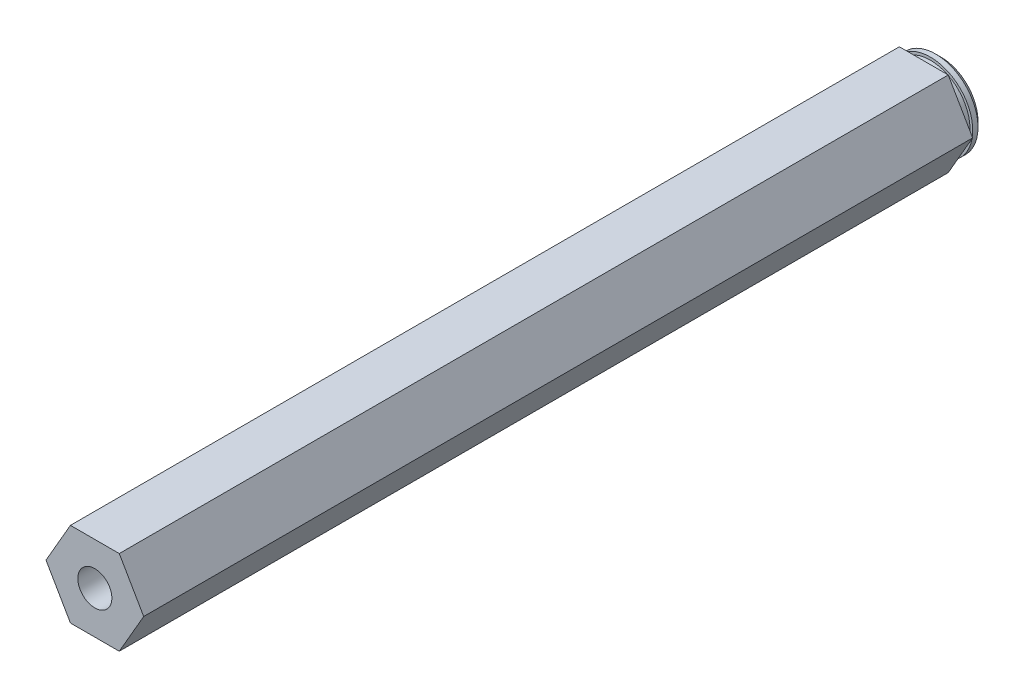
ISO-10303-21;
HEADER;
FILE_DESCRIPTION(('STEP AP214'),'2;1');
FILE_NAME('part.step','',(''),(''),'','','');
FILE_SCHEMA(('AUTOMOTIVE_DESIGN { 1 0 10303 214 1 1 1 1 }'));
ENDSEC;
DATA;
#1=APPLICATION_CONTEXT('core data for automotive mechanical design processes');
#2=APPLICATION_PROTOCOL_DEFINITION('international standard','automotive_design',2000,#1);
#3=PRODUCT_CONTEXT('',#1,'mechanical');
#4=PRODUCT('Part','Part','',(#3));
#5=PRODUCT_RELATED_PRODUCT_CATEGORY('part','',(#4));
#6=PRODUCT_DEFINITION_FORMATION('','',#4);
#7=PRODUCT_DEFINITION_CONTEXT('part definition',#1,'design');
#8=PRODUCT_DEFINITION('design','',#6,#7);
#9=PRODUCT_DEFINITION_SHAPE('','',#8);
#10=(LENGTH_UNIT() NAMED_UNIT(*) SI_UNIT(.MILLI.,.METRE.));
#11=(NAMED_UNIT(*) PLANE_ANGLE_UNIT() SI_UNIT($,.RADIAN.));
#12=(NAMED_UNIT(*) SI_UNIT($,.STERADIAN.) SOLID_ANGLE_UNIT());
#13=UNCERTAINTY_MEASURE_WITH_UNIT(LENGTH_MEASURE(1.E-05),#10,'distance_accuracy_value','');
#14=(GEOMETRIC_REPRESENTATION_CONTEXT(3) GLOBAL_UNCERTAINTY_ASSIGNED_CONTEXT((#13)) GLOBAL_UNIT_ASSIGNED_CONTEXT((#10,
#11,#12)) REPRESENTATION_CONTEXT('',''));
#15=CARTESIAN_POINT('',(0.,0.,0.));
#16=DIRECTION('',(0.,0.,1.));
#17=DIRECTION('',(1.,0.,0.));
#18=AXIS2_PLACEMENT_3D('',#15,#16,#17);
#19=CARTESIAN_POINT('',(0.,0.,-38.0999999999858));
#20=DIRECTION('',(0.,0.,-1.));
#21=DIRECTION('',(-1.,0.,0.));
#22=AXIS2_PLACEMENT_3D('',#19,#20,#21);
#23=CONICAL_SURFACE('',#22,3.18770000006907,1.02974425868264);
#24=CARTESIAN_POINT('',(-5.6843418860808E-11,0.,-36.1846366047018));
#25=VERTEX_POINT('',#24);
#26=VERTEX_LOOP('',#25);
#27=FACE_BOUND('',#26,.T.);
#28=CARTESIAN_POINT('',(0.,0.,-38.1));
#29=DIRECTION('',(0.,0.,-1.));
#30=DIRECTION('',(-1.,0.,0.));
#31=AXIS2_PLACEMENT_3D('',#28,#29,#30);
#32=CIRCLE('',#31,3.1877);
#33=CARTESIAN_POINT('',(-3.1877,0.,-38.1));
#34=VERTEX_POINT('',#33);
#35=EDGE_CURVE('E78',#34,#34,#32,.T.);
#36=ORIENTED_EDGE('',*,*,#35,.T.);
#37=EDGE_LOOP('',(#36));
#38=FACE_BOUND('',#37,.T.);
#39=ADVANCED_FACE('F17',(#27,#38),#23,.F.);
#40=CARTESIAN_POINT('',(0.,0.,-63.5));
#41=DIRECTION('',(0.,0.,-1.));
#42=DIRECTION('',(-1.,0.,0.));
#43=AXIS2_PLACEMENT_3D('',#40,#41,#42);
#44=CYLINDRICAL_SURFACE('',#43,3.1877);
#45=ORIENTED_EDGE('',*,*,#35,.F.);
#46=EDGE_LOOP('',(#45));
#47=FACE_BOUND('',#46,.T.);
#48=CARTESIAN_POINT('',(0.,0.,-63.5));
#49=DIRECTION('',(0.,0.,-1.));
#50=DIRECTION('',(-1.,0.,0.));
#51=AXIS2_PLACEMENT_3D('',#48,#49,#50);
#52=CIRCLE('',#51,3.1877);
#53=CARTESIAN_POINT('',(-3.1877,0.,-63.5));
#54=VERTEX_POINT('',#53);
#55=EDGE_CURVE('E20',#54,#54,#52,.T.);
#56=ORIENTED_EDGE('',*,*,#55,.T.);
#57=EDGE_LOOP('',(#56));
#58=FACE_BOUND('',#57,.T.);
#59=ADVANCED_FACE('F75',(#47,#58),#44,.F.);
#60=CARTESIAN_POINT('',(0.,0.,-63.5));
#61=DIRECTION('',(0.,0.,1.));
#62=DIRECTION('',(1.,0.,0.));
#63=AXIS2_PLACEMENT_3D('',#60,#61,#62);
#64=PLANE('',#63);
#65=ORIENTED_EDGE('',*,*,#55,.F.);
#66=EDGE_LOOP('',(#65));
#67=FACE_BOUND('',#66,.T.);
#68=CARTESIAN_POINT('',(0.,0.,-63.5000000000332));
#69=DIRECTION('',(0.,0.,1.));
#70=DIRECTION('',(1.,0.,0.));
#71=AXIS2_PLACEMENT_3D('',#68,#69,#70);
#72=CIRCLE('',#71,5.55624999998372);
#73=CARTESIAN_POINT('',(5.55624999998372,0.,-63.5000000000332));
#74=VERTEX_POINT('',#73);
#75=EDGE_CURVE('E82',#74,#74,#72,.T.);
#76=ORIENTED_EDGE('',*,*,#75,.F.);
#77=EDGE_LOOP('',(#76));
#78=FACE_BOUND('',#77,.T.);
#79=ADVANCED_FACE('F115',(#67,#78),#64,.F.);
#80=CARTESIAN_POINT('',(0.,0.,-62.7062499999624));
#81=DIRECTION('',(0.,0.,1.));
#82=DIRECTION('',(1.,0.,0.));
#83=AXIS2_PLACEMENT_3D('',#80,#81,#82);
#84=CONICAL_SURFACE('',#83,6.35000000005448,0.785398163397448);
#85=CARTESIAN_POINT('',(0.,0.,-62.70625));
#86=DIRECTION('',(0.,0.,-1.));
#87=DIRECTION('',(-1.,0.,0.));
#88=AXIS2_PLACEMENT_3D('',#85,#86,#87);
#89=CIRCLE('',#88,6.35);
#90=CARTESIAN_POINT('',(-6.35,0.,-62.70625));
#91=VERTEX_POINT('',#90);
#92=EDGE_CURVE('E85',#91,#91,#89,.F.);
#93=ORIENTED_EDGE('',*,*,#92,.F.);
#94=EDGE_LOOP('',(#93));
#95=FACE_BOUND('',#94,.T.);
#96=ORIENTED_EDGE('',*,*,#75,.T.);
#97=EDGE_LOOP('',(#96));
#98=FACE_BOUND('',#97,.T.);
#99=ADVANCED_FACE('F113',(#95,#98),#84,.T.);
#100=CARTESIAN_POINT('',(0.,0.,-60.9219));
#101=DIRECTION('',(0.,0.,-1.));
#102=DIRECTION('',(-1.,0.,0.));
#103=AXIS2_PLACEMENT_3D('',#100,#101,#102);
#104=CYLINDRICAL_SURFACE('',#103,6.35);
#105=ORIENTED_EDGE('',*,*,#92,.T.);
#106=EDGE_LOOP('',(#105));
#107=FACE_BOUND('',#106,.T.);
#108=CARTESIAN_POINT('',(0.,0.,-61.9125));
#109=DIRECTION('',(0.,0.,-1.));
#110=DIRECTION('',(-1.,0.,0.));
#111=AXIS2_PLACEMENT_3D('',#108,#109,#110);
#112=CIRCLE('',#111,6.35);
#113=CARTESIAN_POINT('',(-6.35,0.,-61.9125));
#114=VERTEX_POINT('',#113);
#115=EDGE_CURVE('E101',#114,#114,#112,.F.);
#116=ORIENTED_EDGE('',*,*,#115,.F.);
#117=EDGE_LOOP('',(#116));
#118=FACE_BOUND('',#117,.T.);
#119=ADVANCED_FACE('F110',(#107,#118),#104,.T.);
#120=CARTESIAN_POINT('',(0.,0.,-5.6843418860808E-11));
#121=DIRECTION('',(0.,0.,1.));
#122=DIRECTION('',(1.,0.,0.));
#123=AXIS2_PLACEMENT_3D('',#120,#121,#122);
#124=CONICAL_SURFACE('',#123,2.55269999996699,1.02974425868444);
#125=CARTESIAN_POINT('',(-2.8421709430404E-11,0.,-1.53381690222432));
#126=VERTEX_POINT('',#125);
#127=VERTEX_LOOP('',#126);
#128=FACE_BOUND('',#127,.T.);
#129=CARTESIAN_POINT('',(0.,0.,0.));
#130=DIRECTION('',(0.,0.,1.));
#131=DIRECTION('',(1.,0.,0.));
#132=AXIS2_PLACEMENT_3D('',#129,#130,#131);
#133=CIRCLE('',#132,2.55269999999999);
#134=CARTESIAN_POINT('',(2.55269999999999,0.,0.));
#135=VERTEX_POINT('',#134);
#136=EDGE_CURVE('E103',#135,#135,#133,.T.);
#137=ORIENTED_EDGE('',*,*,#136,.T.);
#138=EDGE_LOOP('',(#137));
#139=FACE_BOUND('',#138,.T.);
#140=ADVANCED_FACE('F122',(#128,#139),#124,.F.);
#141=CARTESIAN_POINT('',(0.,6.35000000000004,-61.9125));
#142=DIRECTION('',(0.,0.,1.));
#143=DIRECTION('',(1.,0.,0.));
#144=AXIS2_PLACEMENT_3D('',#141,#142,#143);
#145=PLANE('',#144);
#146=CARTESIAN_POINT('',(0.,0.,-61.9125));
#147=DIRECTION('',(0.,0.,1.));
#148=DIRECTION('',(1.,0.,0.));
#149=AXIS2_PLACEMENT_3D('',#146,#147,#148);
#150=CIRCLE('',#149,5.9436);
#151=CARTESIAN_POINT('',(5.9436,0.,-61.9125));
#152=VERTEX_POINT('',#151);
#153=EDGE_CURVE('E97',#152,#152,#150,.T.);
#154=ORIENTED_EDGE('',*,*,#153,.F.);
#155=EDGE_LOOP('',(#154));
#156=FACE_BOUND('',#155,.T.);
#157=ORIENTED_EDGE('',*,*,#115,.T.);
#158=EDGE_LOOP('',(#157));
#159=FACE_BOUND('',#158,.T.);
#160=ADVANCED_FACE('F169',(#156,#159),#145,.T.);
#161=CARTESIAN_POINT('',(0.,0.,63.5));
#162=DIRECTION('',(0.,0.,1.));
#163=DIRECTION('',(1.,0.,0.));
#164=AXIS2_PLACEMENT_3D('',#161,#162,#163);
#165=CYLINDRICAL_SURFACE('',#164,2.55269999999999);
#166=CARTESIAN_POINT('',(0.,0.,63.5));
#167=DIRECTION('',(0.,0.,1.));
#168=DIRECTION('',(1.,0.,0.));
#169=AXIS2_PLACEMENT_3D('',#166,#167,#168);
#170=CIRCLE('',#169,2.55269999999999);
#171=CARTESIAN_POINT('',(2.55269999999999,0.,63.5));
#172=VERTEX_POINT('',#171);
#173=EDGE_CURVE('E92',#172,#172,#170,.F.);
#174=ORIENTED_EDGE('',*,*,#173,.F.);
#175=EDGE_LOOP('',(#174));
#176=FACE_BOUND('',#175,.T.);
#177=ORIENTED_EDGE('',*,*,#136,.F.);
#178=EDGE_LOOP('',(#177));
#179=FACE_BOUND('',#178,.T.);
#180=ADVANCED_FACE('F165',(#176,#179),#165,.F.);
#181=CARTESIAN_POINT('',(-3.66617420935414,-6.35000000000003,63.5));
#182=DIRECTION('',(0.,1.,0.));
#183=DIRECTION('',(-1.,0.,0.));
#184=AXIS2_PLACEMENT_3D('',#181,#182,#183);
#185=PLANE('',#184);
#186=DIRECTION('',(0.,0.,1.));
#187=VECTOR('',#186,1.);
#188=CARTESIAN_POINT('',(3.66617420935412,-6.35000000000003,63.5));
#189=LINE('',#188,#187);
#190=CARTESIAN_POINT('',(3.66617420935412,-6.35000000000003,-60.9219));
#191=VERTEX_POINT('',#190);
#192=CARTESIAN_POINT('',(3.66617420935412,-6.35000000000003,63.5));
#193=VERTEX_POINT('',#192);
#194=EDGE_CURVE('E96',#191,#193,#189,.T.);
#195=ORIENTED_EDGE('',*,*,#194,.T.);
#196=DIRECTION('',(1.,0.,0.));
#197=VECTOR('',#196,1.);
#198=CARTESIAN_POINT('',(0.,-6.35000000000003,63.5));
#199=LINE('',#198,#197);
#200=CARTESIAN_POINT('',(-3.66617420935414,-6.35000000000003,63.5));
#201=VERTEX_POINT('',#200);
#202=EDGE_CURVE('E195',#201,#193,#199,.T.);
#203=ORIENTED_EDGE('',*,*,#202,.F.);
#204=DIRECTION('',(0.,0.,1.));
#205=VECTOR('',#204,1.);
#206=CARTESIAN_POINT('',(-3.66617420935414,-6.35000000000003,63.5));
#207=LINE('',#206,#205);
#208=CARTESIAN_POINT('',(-3.66617420935414,-6.35000000000003,-60.9219));
#209=VERTEX_POINT('',#208);
#210=EDGE_CURVE('E181',#201,#209,#207,.F.);
#211=ORIENTED_EDGE('',*,*,#210,.T.);
#212=DIRECTION('',(-1.,0.,0.));
#213=VECTOR('',#212,1.);
#214=CARTESIAN_POINT('',(0.,-6.35000000000003,-60.9219));
#215=LINE('',#214,#213);
#216=EDGE_CURVE('E207',#191,#209,#215,.T.);
#217=ORIENTED_EDGE('',*,*,#216,.F.);
#218=EDGE_LOOP('',(#195,#203,#211,#217));
#219=FACE_BOUND('',#218,.T.);
#220=ADVANCED_FACE('F161',(#219),#185,.F.);
#221=CARTESIAN_POINT('',(-7.33234841870829,0.,63.5));
#222=DIRECTION('',(0.866025403784438,0.500000000000001,0.));
#223=DIRECTION('',(-0.500000000000001,0.866025403784438,0.));
#224=AXIS2_PLACEMENT_3D('',#221,#222,#223);
#225=PLANE('',#224);
#226=ORIENTED_EDGE('',*,*,#210,.F.);
#227=DIRECTION('',(0.500000000000001,-0.866025403784438,0.));
#228=VECTOR('',#227,1.);
#229=CARTESIAN_POINT('',(-7.33234841870829,0.,63.5));
#230=LINE('',#229,#228);
#231=CARTESIAN_POINT('',(-7.33234841870829,0.,63.5));
#232=VERTEX_POINT('',#231);
#233=EDGE_CURVE('E192',#232,#201,#230,.T.);
#234=ORIENTED_EDGE('',*,*,#233,.F.);
#235=DIRECTION('',(0.,0.,1.));
#236=VECTOR('',#235,1.);
#237=CARTESIAN_POINT('',(-7.33234841870829,0.,63.5));
#238=LINE('',#237,#236);
#239=CARTESIAN_POINT('',(-7.33234841870829,0.,-60.9219));
#240=VERTEX_POINT('',#239);
#241=EDGE_CURVE('E100',#232,#240,#238,.F.);
#242=ORIENTED_EDGE('',*,*,#241,.T.);
#243=DIRECTION('',(-0.500000000000001,0.866025403784438,0.));
#244=VECTOR('',#243,1.);
#245=CARTESIAN_POINT('',(-3.66617420935414,-6.35000000000003,-60.9219));
#246=LINE('',#245,#244);
#247=EDGE_CURVE('E209',#209,#240,#246,.T.);
#248=ORIENTED_EDGE('',*,*,#247,.F.);
#249=EDGE_LOOP('',(#226,#234,#242,#248));
#250=FACE_BOUND('',#249,.T.);
#251=ADVANCED_FACE('F157',(#250),#225,.F.);
#252=CARTESIAN_POINT('',(-3.66617420935414,6.35000000000004,63.5));
#253=DIRECTION('',(0.866025403784439,-0.499999999999999,0.));
#254=DIRECTION('',(0.499999999999999,0.866025403784439,0.));
#255=AXIS2_PLACEMENT_3D('',#252,#253,#254);
#256=PLANE('',#255);
#257=ORIENTED_EDGE('',*,*,#241,.F.);
#258=DIRECTION('',(-0.499999999999999,-0.866025403784439,0.));
#259=VECTOR('',#258,1.);
#260=CARTESIAN_POINT('',(-3.66617420935414,6.35000000000004,63.5));
#261=LINE('',#260,#259);
#262=CARTESIAN_POINT('',(-3.66617420935414,6.35000000000004,63.5));
#263=VERTEX_POINT('',#262);
#264=EDGE_CURVE('E189',#263,#232,#261,.T.);
#265=ORIENTED_EDGE('',*,*,#264,.F.);
#266=DIRECTION('',(0.,0.,-1.));
#267=VECTOR('',#266,1.);
#268=CARTESIAN_POINT('',(-3.66617420935414,6.35000000000004,63.5));
#269=LINE('',#268,#267);
#270=CARTESIAN_POINT('',(-3.66617420935414,6.35000000000004,-60.9219));
#271=VERTEX_POINT('',#270);
#272=EDGE_CURVE('E201',#263,#271,#269,.T.);
#273=ORIENTED_EDGE('',*,*,#272,.T.);
#274=DIRECTION('',(0.499999999999999,0.866025403784439,0.));
#275=VECTOR('',#274,1.);
#276=CARTESIAN_POINT('',(-7.33234841870829,0.,-60.9219));
#277=LINE('',#276,#275);
#278=EDGE_CURVE('E91',#240,#271,#277,.T.);
#279=ORIENTED_EDGE('',*,*,#278,.F.);
#280=EDGE_LOOP('',(#257,#265,#273,#279));
#281=FACE_BOUND('',#280,.T.);
#282=ADVANCED_FACE('F153',(#281),#256,.F.);
#283=CARTESIAN_POINT('',(0.,0.,0.));
#284=DIRECTION('',(0.,0.,1.));
#285=DIRECTION('',(1.,0.,0.));
#286=AXIS2_PLACEMENT_3D('',#283,#284,#285);
#287=CYLINDRICAL_SURFACE('',#286,5.9436);
#288=ORIENTED_EDGE('',*,*,#153,.T.);
#289=EDGE_LOOP('',(#288));
#290=FACE_BOUND('',#289,.T.);
#291=CARTESIAN_POINT('',(0.,0.,-60.9219));
#292=DIRECTION('',(0.,0.,1.));
#293=DIRECTION('',(1.,0.,0.));
#294=AXIS2_PLACEMENT_3D('',#291,#292,#293);
#295=CIRCLE('',#294,5.9436);
#296=CARTESIAN_POINT('',(5.9436,0.,-60.9219));
#297=VERTEX_POINT('',#296);
#298=EDGE_CURVE('E87',#297,#297,#295,.T.);
#299=ORIENTED_EDGE('',*,*,#298,.F.);
#300=EDGE_LOOP('',(#299));
#301=FACE_BOUND('',#300,.T.);
#302=ADVANCED_FACE('F149',(#290,#301),#287,.T.);
#303=CARTESIAN_POINT('',(3.66617420935412,-6.35000000000003,63.5));
#304=DIRECTION('',(-0.866025403784439,0.499999999999999,0.));
#305=DIRECTION('',(-0.499999999999999,-0.866025403784439,0.));
#306=AXIS2_PLACEMENT_3D('',#303,#304,#305);
#307=PLANE('',#306);
#308=DIRECTION('',(0.,0.,1.));
#309=VECTOR('',#308,1.);
#310=CARTESIAN_POINT('',(7.33234841870825,0.,63.5));
#311=LINE('',#310,#309);
#312=CARTESIAN_POINT('',(7.33234841870825,0.,-60.9219));
#313=VERTEX_POINT('',#312);
#314=CARTESIAN_POINT('',(7.33234841870825,0.,63.5));
#315=VERTEX_POINT('',#314);
#316=EDGE_CURVE('E90',#313,#315,#311,.T.);
#317=ORIENTED_EDGE('',*,*,#316,.T.);
#318=DIRECTION('',(0.499999999999999,0.866025403784439,0.));
#319=VECTOR('',#318,1.);
#320=CARTESIAN_POINT('',(3.66617420935412,-6.35000000000003,63.5));
#321=LINE('',#320,#319);
#322=EDGE_CURVE('E95',#193,#315,#321,.T.);
#323=ORIENTED_EDGE('',*,*,#322,.F.);
#324=ORIENTED_EDGE('',*,*,#194,.F.);
#325=DIRECTION('',(-0.5,-0.866025403784439,0.));
#326=VECTOR('',#325,1.);
#327=CARTESIAN_POINT('',(7.33234841870825,0.,-60.9219));
#328=LINE('',#327,#326);
#329=EDGE_CURVE('E204',#313,#191,#328,.T.);
#330=ORIENTED_EDGE('',*,*,#329,.F.);
#331=EDGE_LOOP('',(#317,#323,#324,#330));
#332=FACE_BOUND('',#331,.T.);
#333=ADVANCED_FACE('F145',(#332),#307,.F.);
#334=CARTESIAN_POINT('',(0.,0.,63.5));
#335=DIRECTION('',(0.,0.,1.));
#336=DIRECTION('',(1.,0.,0.));
#337=AXIS2_PLACEMENT_3D('',#334,#335,#336);
#338=PLANE('',#337);
#339=ORIENTED_EDGE('',*,*,#233,.T.);
#340=ORIENTED_EDGE('',*,*,#202,.T.);
#341=ORIENTED_EDGE('',*,*,#322,.T.);
#342=DIRECTION('',(0.5,-0.866025403784439,0.));
#343=VECTOR('',#342,1.);
#344=CARTESIAN_POINT('',(7.33234841870825,0.,63.5));
#345=LINE('',#344,#343);
#346=CARTESIAN_POINT('',(3.6661742093541,6.35000000000004,63.5));
#347=VERTEX_POINT('',#346);
#348=EDGE_CURVE('E214',#315,#347,#345,.F.);
#349=ORIENTED_EDGE('',*,*,#348,.T.);
#350=DIRECTION('',(1.,0.,0.));
#351=VECTOR('',#350,1.);
#352=CARTESIAN_POINT('',(3.6661742093541,6.35000000000004,63.5));
#353=LINE('',#352,#351);
#354=EDGE_CURVE('E198',#347,#263,#353,.F.);
#355=ORIENTED_EDGE('',*,*,#354,.T.);
#356=ORIENTED_EDGE('',*,*,#264,.T.);
#357=EDGE_LOOP('',(#339,#340,#341,#349,#355,#356));
#358=FACE_BOUND('',#357,.T.);
#359=ORIENTED_EDGE('',*,*,#173,.T.);
#360=EDGE_LOOP('',(#359));
#361=FACE_BOUND('',#360,.T.);
#362=ADVANCED_FACE('F141',(#358,#361),#338,.T.);
#363=CARTESIAN_POINT('',(3.6661742093541,6.35000000000004,63.5));
#364=DIRECTION('',(0.,-1.,0.));
#365=DIRECTION('',(0.,0.,-1.));
#366=AXIS2_PLACEMENT_3D('',#363,#364,#365);
#367=PLANE('',#366);
#368=ORIENTED_EDGE('',*,*,#272,.F.);
#369=ORIENTED_EDGE('',*,*,#354,.F.);
#370=DIRECTION('',(0.,0.,1.));
#371=VECTOR('',#370,1.);
#372=CARTESIAN_POINT('',(3.6661742093541,6.35000000000004,63.5));
#373=LINE('',#372,#371);
#374=CARTESIAN_POINT('',(3.6661742093541,6.35000000000004,-60.9219));
#375=VERTEX_POINT('',#374);
#376=EDGE_CURVE('E26',#347,#375,#373,.F.);
#377=ORIENTED_EDGE('',*,*,#376,.T.);
#378=DIRECTION('',(-1.,0.,0.));
#379=VECTOR('',#378,1.);
#380=CARTESIAN_POINT('',(0.,6.35000000000004,-60.9219));
#381=LINE('',#380,#379);
#382=EDGE_CURVE('E34',#271,#375,#381,.F.);
#383=ORIENTED_EDGE('',*,*,#382,.F.);
#384=EDGE_LOOP('',(#368,#369,#377,#383));
#385=FACE_BOUND('',#384,.T.);
#386=ADVANCED_FACE('F134',(#385),#367,.F.);
#387=CARTESIAN_POINT('',(0.,0.,-60.9219));
#388=DIRECTION('',(0.,0.,-1.));
#389=DIRECTION('',(-1.,0.,0.));
#390=AXIS2_PLACEMENT_3D('',#387,#388,#389);
#391=PLANE('',#390);
#392=ORIENTED_EDGE('',*,*,#298,.T.);
#393=EDGE_LOOP('',(#392));
#394=FACE_BOUND('',#393,.T.);
#395=ORIENTED_EDGE('',*,*,#247,.T.);
#396=ORIENTED_EDGE('',*,*,#278,.T.);
#397=ORIENTED_EDGE('',*,*,#382,.T.);
#398=DIRECTION('',(0.5,-0.866025403784439,0.));
#399=VECTOR('',#398,1.);
#400=CARTESIAN_POINT('',(7.33234841870825,0.,-60.9219));
#401=LINE('',#400,#399);
#402=EDGE_CURVE('E10',#375,#313,#401,.T.);
#403=ORIENTED_EDGE('',*,*,#402,.T.);
#404=ORIENTED_EDGE('',*,*,#329,.T.);
#405=ORIENTED_EDGE('',*,*,#216,.T.);
#406=EDGE_LOOP('',(#395,#396,#397,#403,#404,#405));
#407=FACE_BOUND('',#406,.T.);
#408=ADVANCED_FACE('F128',(#394,#407),#391,.T.);
#409=CARTESIAN_POINT('',(7.33234841870825,0.,63.5));
#410=DIRECTION('',(-0.866025403784439,-0.5,0.));
#411=DIRECTION('',(0.5,-0.866025403784439,0.));
#412=AXIS2_PLACEMENT_3D('',#409,#410,#411);
#413=PLANE('',#412);
#414=ORIENTED_EDGE('',*,*,#376,.F.);
#415=ORIENTED_EDGE('',*,*,#348,.F.);
#416=ORIENTED_EDGE('',*,*,#316,.F.);
#417=ORIENTED_EDGE('',*,*,#402,.F.);
#418=EDGE_LOOP('',(#414,#415,#416,#417));
#419=FACE_BOUND('',#418,.T.);
#420=ADVANCED_FACE('F126',(#419),#413,.F.);
#421=CLOSED_SHELL('',(#39,#59,#79,#99,#119,#140,#160,#180,#220,#251,#282,#302,#333,#362,#386,
#408,#420));
#422=MANIFOLD_SOLID_BREP('B1',#421);
#423=ADVANCED_BREP_SHAPE_REPRESENTATION('',(#18,#422),#14);
#424=SHAPE_DEFINITION_REPRESENTATION(#9,#423);
ENDSEC;
END-ISO-10303-21;
